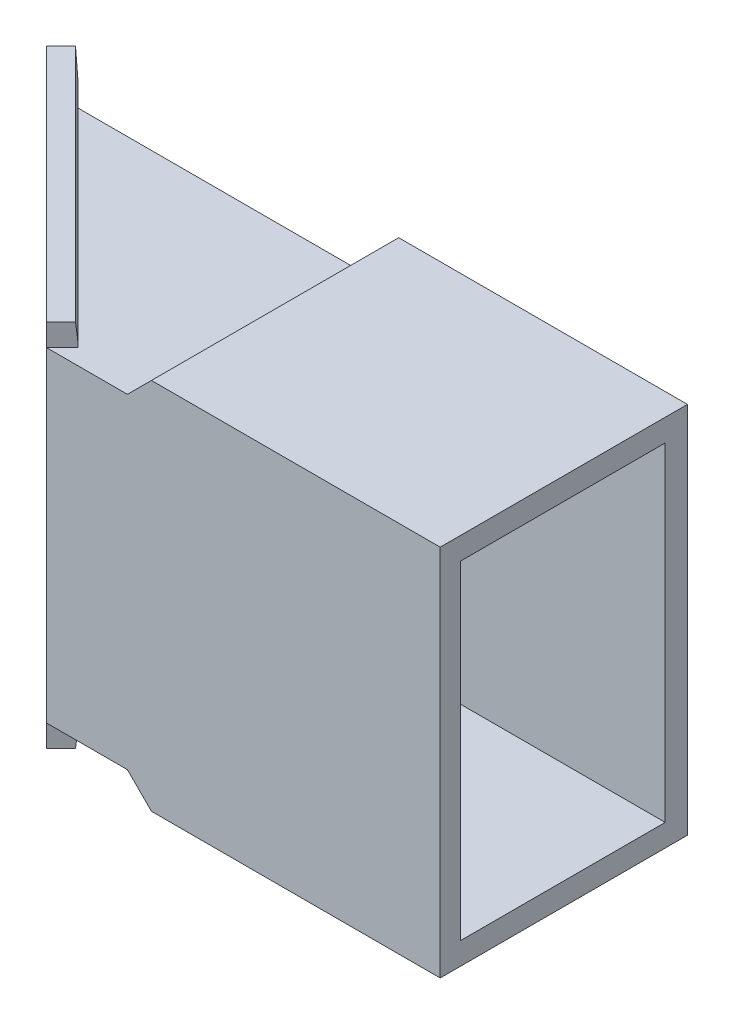
ISO-10303-21;
HEADER;
FILE_DESCRIPTION(('STEP AP214'),'2;1');
FILE_NAME('part.step','',(''),(''),'','','');
FILE_SCHEMA(('AUTOMOTIVE_DESIGN { 1 0 10303 214 1 1 1 1 }'));
ENDSEC;
DATA;
#1=APPLICATION_CONTEXT('core data for automotive mechanical design processes');
#2=APPLICATION_PROTOCOL_DEFINITION('international standard','automotive_design',2000,#1);
#3=PRODUCT_CONTEXT('',#1,'mechanical');
#4=PRODUCT('Part','Part','',(#3));
#5=PRODUCT_RELATED_PRODUCT_CATEGORY('part','',(#4));
#6=PRODUCT_DEFINITION_FORMATION('','',#4);
#7=PRODUCT_DEFINITION_CONTEXT('part definition',#1,'design');
#8=PRODUCT_DEFINITION('design','',#6,#7);
#9=PRODUCT_DEFINITION_SHAPE('','',#8);
#10=(LENGTH_UNIT() NAMED_UNIT(*) SI_UNIT(.MILLI.,.METRE.));
#11=(NAMED_UNIT(*) PLANE_ANGLE_UNIT() SI_UNIT($,.RADIAN.));
#12=(NAMED_UNIT(*) SI_UNIT($,.STERADIAN.) SOLID_ANGLE_UNIT());
#13=UNCERTAINTY_MEASURE_WITH_UNIT(LENGTH_MEASURE(1.E-05),#10,'distance_accuracy_value','');
#14=(GEOMETRIC_REPRESENTATION_CONTEXT(3) GLOBAL_UNCERTAINTY_ASSIGNED_CONTEXT((#13)) GLOBAL_UNIT_ASSIGNED_CONTEXT((#10,
#11,#12)) REPRESENTATION_CONTEXT('',''));
#15=CARTESIAN_POINT('',(0.,0.,0.));
#16=DIRECTION('',(0.,0.,1.));
#17=DIRECTION('',(1.,0.,0.));
#18=AXIS2_PLACEMENT_3D('',#15,#16,#17);
#19=CARTESIAN_POINT('',(-2.54,7.2644,15.9258));
#20=DIRECTION('',(0.,0.,-1.));
#21=DIRECTION('',(-1.,0.,0.));
#22=AXIS2_PLACEMENT_3D('',#19,#20,#21);
#23=PLANE('',#22);
#24=DIRECTION('',(-0.707106781186547,0.707106781186548,0.));
#25=VECTOR('',#24,1.);
#26=CARTESIAN_POINT('',(47.879,-26.6192,15.9258));
#27=LINE('',#26,#25);
#28=CARTESIAN_POINT('',(47.879,-26.6192,15.9258));
#29=VERTEX_POINT('',#28);
#30=CARTESIAN_POINT('',(44.45,-23.1902,15.9258));
#31=VERTEX_POINT('',#30);
#32=EDGE_CURVE('E281',#29,#31,#27,.T.);
#33=ORIENTED_EDGE('',*,*,#32,.F.);
#34=DIRECTION('',(-1.,0.,0.));
#35=VECTOR('',#34,1.);
#36=CARTESIAN_POINT('',(89.0778,-26.6192,15.9258));
#37=LINE('',#36,#35);
#38=CARTESIAN_POINT('',(89.0778,-26.6192,15.9258));
#39=VERTEX_POINT('',#38);
#40=EDGE_CURVE('E276',#39,#29,#37,.T.);
#41=ORIENTED_EDGE('',*,*,#40,.F.);
#42=DIRECTION('',(0.,-1.,0.));
#43=VECTOR('',#42,1.);
#44=CARTESIAN_POINT('',(89.0778,-26.6192,15.9258));
#45=LINE('',#44,#43);
#46=CARTESIAN_POINT('',(89.0778,26.6192,15.9258));
#47=VERTEX_POINT('',#46);
#48=EDGE_CURVE('E253',#47,#39,#45,.T.);
#49=ORIENTED_EDGE('',*,*,#48,.F.);
#50=DIRECTION('',(-1.,0.,0.));
#51=VECTOR('',#50,1.);
#52=CARTESIAN_POINT('',(89.0778,26.6192,15.9258));
#53=LINE('',#52,#51);
#54=CARTESIAN_POINT('',(47.879,26.6192,15.9258));
#55=VERTEX_POINT('',#54);
#56=EDGE_CURVE('E268',#47,#55,#53,.T.);
#57=ORIENTED_EDGE('',*,*,#56,.T.);
#58=DIRECTION('',(0.707106781186547,0.707106781186548,0.));
#59=VECTOR('',#58,1.);
#60=CARTESIAN_POINT('',(44.45,23.1902,15.9258));
#61=LINE('',#60,#59);
#62=CARTESIAN_POINT('',(44.45,23.1902,15.9258));
#63=VERTEX_POINT('',#62);
#64=EDGE_CURVE('E285',#63,#55,#61,.T.);
#65=ORIENTED_EDGE('',*,*,#64,.F.);
#66=DIRECTION('',(-1.,0.,0.));
#67=VECTOR('',#66,1.);
#68=CARTESIAN_POINT('',(-2.54,23.1902,15.9258));
#69=LINE('',#68,#67);
#70=CARTESIAN_POINT('',(32.9127280605346,23.1902,15.9258));
#71=VERTEX_POINT('',#70);
#72=EDGE_CURVE('E289',#71,#63,#69,.F.);
#73=ORIENTED_EDGE('',*,*,#72,.F.);
#74=DIRECTION('',(0.,1.,0.));
#75=VECTOR('',#74,1.);
#76=CARTESIAN_POINT('',(32.9127280605346,7.2644,15.9258));
#77=LINE('',#76,#75);
#78=CARTESIAN_POINT('',(32.9127280605346,-23.1902,15.9258));
#79=VERTEX_POINT('',#78);
#80=EDGE_CURVE('E11',#79,#71,#77,.T.);
#81=ORIENTED_EDGE('',*,*,#80,.F.);
#82=DIRECTION('',(-1.,0.,0.));
#83=VECTOR('',#82,1.);
#84=CARTESIAN_POINT('',(-2.54,-23.1902,15.9258));
#85=LINE('',#84,#83);
#86=EDGE_CURVE('E45',#31,#79,#85,.T.);
#87=ORIENTED_EDGE('',*,*,#86,.F.);
#88=EDGE_LOOP('',(#33,#41,#49,#57,#65,#73,#81,#87));
#89=FACE_BOUND('',#88,.T.);
#90=ADVANCED_FACE('F35',(#89),#23,.F.);
#91=CARTESIAN_POINT('',(18.1094600756682,23.8252,-3.36759604540094));
#92=DIRECTION('',(-0.703597544730292,-0.0995037190209983,0.703597544730292));
#93=DIRECTION('',(0.707106781186547,0.,0.707106781186547));
#94=AXIS2_PLACEMENT_3D('',#91,#92,#93);
#95=PLANE('',#94);
#96=DIRECTION('',(0.707106781186548,0.,0.707106781186548));
#97=VECTOR('',#96,1.);
#98=CARTESIAN_POINT('',(18.1094600756682,23.8252,-3.36759604540094));
#99=LINE('',#98,#97);
#100=CARTESIAN_POINT('',(35.1577920908019,23.8252,13.6807359697327));
#101=VERTEX_POINT('',#100);
#102=CARTESIAN_POINT('',(2.8571792847484,23.8252,-18.6198768363207));
#103=VERTEX_POINT('',#102);
#104=EDGE_CURVE('E409',#101,#103,#99,.F.);
#105=ORIENTED_EDGE('',*,*,#104,.T.);
#106=DIRECTION('',(-0.548630134859201,0.705345615858594,-0.448879201248438));
#107=VECTOR('',#106,1.);
#108=CARTESIAN_POINT('',(2.85717928474839,23.8252,-18.6198768363207));
#109=LINE('',#108,#107);
#110=CARTESIAN_POINT('',(0.881522938113187,26.3652,-20.2363229381132));
#111=VERTEX_POINT('',#110);
#112=EDGE_CURVE('E39',#103,#111,#109,.T.);
#113=ORIENTED_EDGE('',*,*,#112,.T.);
#114=DIRECTION('',(0.707106781186548,0.,0.707106781186547));
#115=VECTOR('',#114,1.);
#116=CARTESIAN_POINT('',(0.881522938113183,26.3652,-20.2363229381132));
#117=LINE('',#116,#115);
#118=CARTESIAN_POINT('',(34.9781869683805,26.3652,13.8603410921541));
#119=VERTEX_POINT('',#118);
#120=EDGE_CURVE('E375',#111,#119,#117,.T.);
#121=ORIENTED_EDGE('',*,*,#120,.T.);
#122=DIRECTION('',(0.0703597544730353,-0.995037190209988,-0.070359754473036));
#123=VECTOR('',#122,1.);
#124=CARTESIAN_POINT('',(34.9781869683805,26.3652,13.8603410921541));
#125=LINE('',#124,#123);
#126=EDGE_CURVE('E383',#119,#101,#125,.T.);
#127=ORIENTED_EDGE('',*,*,#126,.T.);
#128=EDGE_LOOP('',(#105,#113,#121,#127));
#129=FACE_BOUND('',#128,.T.);
#130=ADVANCED_FACE('F37',(#129),#95,.F.);
#131=CARTESIAN_POINT('',(2.8571792847484,7.2644,-18.6198768363207));
#132=DIRECTION('',(-0.633237790257263,0.,0.773957299203321));
#133=DIRECTION('',(0.773957299203321,0.,0.633237790257263));
#134=AXIS2_PLACEMENT_3D('',#131,#132,#133);
#135=PLANE('',#134);
#136=DIRECTION('',(-0.548630134859201,-0.705345615858593,-0.448879201248439));
#137=VECTOR('',#136,1.);
#138=CARTESIAN_POINT('',(2.85717928474838,-23.8252,-18.6198768363208));
#139=LINE('',#138,#137);
#140=CARTESIAN_POINT('',(2.85717928474837,-23.8252,-18.6198768363207));
#141=VERTEX_POINT('',#140);
#142=CARTESIAN_POINT('',(0.88152293811317,-26.3652,-20.2363229381132));
#143=VERTEX_POINT('',#142);
#144=EDGE_CURVE('E416',#141,#143,#139,.T.);
#145=ORIENTED_EDGE('',*,*,#144,.T.);
#146=DIRECTION('',(0.,1.,0.));
#147=VECTOR('',#146,1.);
#148=CARTESIAN_POINT('',(0.881522938113225,7.2644,-20.2363229381133));
#149=LINE('',#148,#147);
#150=EDGE_CURVE('E363',#143,#111,#149,.T.);
#151=ORIENTED_EDGE('',*,*,#150,.T.);
#152=ORIENTED_EDGE('',*,*,#112,.F.);
#153=DIRECTION('',(0.,1.,0.));
#154=VECTOR('',#153,1.);
#155=CARTESIAN_POINT('',(2.85717928474842,7.2644,-18.6198768363207));
#156=LINE('',#155,#154);
#157=EDGE_CURVE('E405',#103,#141,#156,.F.);
#158=ORIENTED_EDGE('',*,*,#157,.T.);
#159=EDGE_LOOP('',(#145,#151,#152,#158));
#160=FACE_BOUND('',#159,.T.);
#161=ADVANCED_FACE('F428',(#160),#135,.F.);
#162=CARTESIAN_POINT('',(18.1094600756682,-23.8252,-3.36759604540096));
#163=DIRECTION('',(-0.703597544730292,0.0995037190209977,0.703597544730292));
#164=DIRECTION('',(0.707106781186547,0.,0.707106781186547));
#165=AXIS2_PLACEMENT_3D('',#162,#163,#164);
#166=PLANE('',#165);
#167=DIRECTION('',(-0.707106781186547,0.,-0.707106781186548));
#168=VECTOR('',#167,1.);
#169=CARTESIAN_POINT('',(34.9781869683805,-26.3652,13.8603410921541));
#170=LINE('',#169,#168);
#171=CARTESIAN_POINT('',(34.9781869683805,-26.3652,13.8603410921541));
#172=VERTEX_POINT('',#171);
#173=EDGE_CURVE('E359',#172,#143,#170,.T.);
#174=ORIENTED_EDGE('',*,*,#173,.T.);
#175=ORIENTED_EDGE('',*,*,#144,.F.);
#176=DIRECTION('',(0.707106781186548,0.,0.707106781186548));
#177=VECTOR('',#176,1.);
#178=CARTESIAN_POINT('',(18.1094600756682,-23.8252,-3.36759604540094));
#179=LINE('',#178,#177);
#180=CARTESIAN_POINT('',(35.1577920908019,-23.8252,13.6807359697327));
#181=VERTEX_POINT('',#180);
#182=EDGE_CURVE('E401',#141,#181,#179,.T.);
#183=ORIENTED_EDGE('',*,*,#182,.T.);
#184=DIRECTION('',(-0.0703597544730353,-0.995037190209988,0.0703597544730353));
#185=VECTOR('',#184,1.);
#186=CARTESIAN_POINT('',(35.1577920908019,-23.8252,13.6807359697327));
#187=LINE('',#186,#185);
#188=EDGE_CURVE('E391',#181,#172,#187,.T.);
#189=ORIENTED_EDGE('',*,*,#188,.T.);
#190=EDGE_LOOP('',(#174,#175,#183,#189));
#191=FACE_BOUND('',#190,.T.);
#192=ADVANCED_FACE('F450',(#191),#166,.F.);
#193=CARTESIAN_POINT('',(47.879,7.2644,-19.3548));
#194=DIRECTION('',(-0.707106781186548,0.,-0.707106781186548));
#195=DIRECTION('',(-0.707106781186548,0.,0.707106781186548));
#196=AXIS2_PLACEMENT_3D('',#193,#194,#195);
#197=PLANE('',#196);
#198=DIRECTION('',(0.,1.,0.));
#199=VECTOR('',#198,1.);
#200=CARTESIAN_POINT('',(44.45,7.2644,-15.9258));
#201=LINE('',#200,#199);
#202=CARTESIAN_POINT('',(44.45,23.1902,-15.9258));
#203=VERTEX_POINT('',#202);
#204=CARTESIAN_POINT('',(44.45,-23.1902,-15.9258));
#205=VERTEX_POINT('',#204);
#206=EDGE_CURVE('E398',#203,#205,#201,.F.);
#207=ORIENTED_EDGE('',*,*,#206,.F.);
#208=DIRECTION('',(-0.577350269189626,-0.577350269189626,0.577350269189626));
#209=VECTOR('',#208,1.);
#210=CARTESIAN_POINT('',(47.879,26.6192,-19.3548));
#211=LINE('',#210,#209);
#212=CARTESIAN_POINT('',(47.879,26.6192,-19.3548));
#213=VERTEX_POINT('',#212);
#214=EDGE_CURVE('E337',#213,#203,#211,.T.);
#215=ORIENTED_EDGE('',*,*,#214,.F.);
#216=DIRECTION('',(0.,1.,0.));
#217=VECTOR('',#216,1.);
#218=CARTESIAN_POINT('',(47.879,7.2644,-19.3548));
#219=LINE('',#218,#217);
#220=CARTESIAN_POINT('',(47.879,-26.6192,-19.3548));
#221=VERTEX_POINT('',#220);
#222=EDGE_CURVE('E413',#213,#221,#219,.F.);
#223=ORIENTED_EDGE('',*,*,#222,.T.);
#224=DIRECTION('',(0.577350269189626,-0.577350269189625,-0.577350269189626));
#225=VECTOR('',#224,1.);
#226=CARTESIAN_POINT('',(44.45,-23.1902,-15.9258));
#227=LINE('',#226,#225);
#228=EDGE_CURVE('E327',#205,#221,#227,.T.);
#229=ORIENTED_EDGE('',*,*,#228,.F.);
#230=EDGE_LOOP('',(#207,#215,#223,#229));
#231=FACE_BOUND('',#230,.T.);
#232=ADVANCED_FACE('F495',(#231),#197,.T.);
#233=CARTESIAN_POINT('',(18.1094600756682,7.2644,-3.36759604540094));
#234=DIRECTION('',(-0.707106781186548,0.,0.707106781186548));
#235=DIRECTION('',(0.707106781186548,0.,0.707106781186548));
#236=AXIS2_PLACEMENT_3D('',#233,#234,#235);
#237=PLANE('',#236);
#238=DIRECTION('',(-0.707106781186548,0.,-0.707106781186547));
#239=VECTOR('',#238,1.);
#240=CARTESIAN_POINT('',(35.1577920908019,-23.1902,13.6807359697327));
#241=LINE('',#240,#239);
#242=CARTESIAN_POINT('',(35.1577920908019,-23.1902,13.6807359697327));
#243=VERTEX_POINT('',#242);
#244=CARTESIAN_POINT('',(5.55125612106915,-23.1902,-15.9258));
#245=VERTEX_POINT('',#244);
#246=EDGE_CURVE('E316',#243,#245,#241,.T.);
#247=ORIENTED_EDGE('',*,*,#246,.F.);
#248=DIRECTION('',(0.,1.,0.));
#249=VECTOR('',#248,1.);
#250=CARTESIAN_POINT('',(35.1577920908019,-24.7777,13.6807359697327));
#251=LINE('',#250,#249);
#252=EDGE_CURVE('E387',#243,#181,#251,.F.);
#253=ORIENTED_EDGE('',*,*,#252,.T.);
#254=ORIENTED_EDGE('',*,*,#182,.F.);
#255=ORIENTED_EDGE('',*,*,#157,.F.);
#256=ORIENTED_EDGE('',*,*,#104,.F.);
#257=DIRECTION('',(0.,1.,0.));
#258=VECTOR('',#257,1.);
#259=CARTESIAN_POINT('',(35.1577920908019,24.7777,13.6807359697327));
#260=LINE('',#259,#258);
#261=CARTESIAN_POINT('',(35.1577920908019,23.1902,13.6807359697327));
#262=VERTEX_POINT('',#261);
#263=EDGE_CURVE('E379',#101,#262,#260,.F.);
#264=ORIENTED_EDGE('',*,*,#263,.T.);
#265=DIRECTION('',(0.707106781186548,0.,0.707106781186547));
#266=VECTOR('',#265,1.);
#267=CARTESIAN_POINT('',(5.55125612106915,23.1902,-15.9258));
#268=LINE('',#267,#266);
#269=CARTESIAN_POINT('',(5.55125612106915,23.1902,-15.9258));
#270=VERTEX_POINT('',#269);
#271=EDGE_CURVE('E344',#270,#262,#268,.T.);
#272=ORIENTED_EDGE('',*,*,#271,.F.);
#273=DIRECTION('',(0.,1.,0.));
#274=VECTOR('',#273,1.);
#275=CARTESIAN_POINT('',(5.55125612106915,7.2644,-15.9258));
#276=LINE('',#275,#274);
#277=EDGE_CURVE('E395',#245,#270,#276,.T.);
#278=ORIENTED_EDGE('',*,*,#277,.F.);
#279=EDGE_LOOP('',(#247,#253,#254,#255,#256,#264,#272,#278));
#280=FACE_BOUND('',#279,.T.);
#281=ADVANCED_FACE('F446',(#280),#237,.F.);
#282=CARTESIAN_POINT('',(-2.54,7.2644,-15.9258));
#283=DIRECTION('',(0.,0.,-1.));
#284=DIRECTION('',(-1.,0.,0.));
#285=AXIS2_PLACEMENT_3D('',#282,#283,#284);
#286=PLANE('',#285);
#287=ORIENTED_EDGE('',*,*,#277,.T.);
#288=DIRECTION('',(1.,0.,0.));
#289=VECTOR('',#288,1.);
#290=CARTESIAN_POINT('',(-2.54,23.1902,-15.9258));
#291=LINE('',#290,#289);
#292=EDGE_CURVE('E347',#203,#270,#291,.F.);
#293=ORIENTED_EDGE('',*,*,#292,.F.);
#294=ORIENTED_EDGE('',*,*,#206,.T.);
#295=DIRECTION('',(1.,0.,0.));
#296=VECTOR('',#295,1.);
#297=CARTESIAN_POINT('',(-2.54,-23.1902,-15.9258));
#298=LINE('',#297,#296);
#299=EDGE_CURVE('E312',#245,#205,#298,.T.);
#300=ORIENTED_EDGE('',*,*,#299,.F.);
#301=EDGE_LOOP('',(#287,#293,#294,#300));
#302=FACE_BOUND('',#301,.T.);
#303=ADVANCED_FACE('F493',(#302),#286,.T.);
#304=CARTESIAN_POINT('',(35.1577920908019,-24.7777,13.6807359697327));
#305=DIRECTION('',(-0.707106781186548,0.,-0.707106781186548));
#306=DIRECTION('',(-0.707106781186548,0.,0.707106781186548));
#307=AXIS2_PLACEMENT_3D('',#304,#305,#306);
#308=PLANE('',#307);
#309=DIRECTION('',(0.707106781186548,0.,-0.707106781186548));
#310=VECTOR('',#309,1.);
#311=CARTESIAN_POINT('',(32.9127280605346,-23.1902,15.9258));
#312=LINE('',#311,#310);
#313=EDGE_CURVE('E319',#79,#243,#312,.T.);
#314=ORIENTED_EDGE('',*,*,#313,.F.);
#315=DIRECTION('',(0.,1.,0.));
#316=VECTOR('',#315,1.);
#317=CARTESIAN_POINT('',(32.9127280605346,7.2644,15.9258));
#318=LINE('',#317,#316);
#319=CARTESIAN_POINT('',(32.9127280605346,-26.3652,15.9258));
#320=VERTEX_POINT('',#319);
#321=EDGE_CURVE('E306',#320,#79,#318,.T.);
#322=ORIENTED_EDGE('',*,*,#321,.F.);
#323=DIRECTION('',(0.707106781186548,0.,-0.707106781186547));
#324=VECTOR('',#323,1.);
#325=CARTESIAN_POINT('',(32.9127280605346,-26.3652,15.9258));
#326=LINE('',#325,#324);
#327=EDGE_CURVE('E351',#320,#172,#326,.T.);
#328=ORIENTED_EDGE('',*,*,#327,.T.);
#329=ORIENTED_EDGE('',*,*,#188,.F.);
#330=ORIENTED_EDGE('',*,*,#252,.F.);
#331=EDGE_LOOP('',(#314,#322,#328,#329,#330));
#332=FACE_BOUND('',#331,.T.);
#333=ADVANCED_FACE('F456',(#332),#308,.F.);
#334=CARTESIAN_POINT('',(35.1577920908019,24.7777,13.6807359697327));
#335=DIRECTION('',(-0.707106781186548,0.,-0.707106781186548));
#336=DIRECTION('',(-0.707106781186548,0.,0.707106781186548));
#337=AXIS2_PLACEMENT_3D('',#334,#335,#336);
#338=PLANE('',#337);
#339=ORIENTED_EDGE('',*,*,#126,.F.);
#340=DIRECTION('',(-0.707106781186547,0.,0.707106781186547));
#341=VECTOR('',#340,1.);
#342=CARTESIAN_POINT('',(34.9781869683805,26.3652,13.8603410921541));
#343=LINE('',#342,#341);
#344=CARTESIAN_POINT('',(32.9127280605346,26.3652,15.9258));
#345=VERTEX_POINT('',#344);
#346=EDGE_CURVE('E371',#119,#345,#343,.T.);
#347=ORIENTED_EDGE('',*,*,#346,.T.);
#348=DIRECTION('',(0.,1.,0.));
#349=VECTOR('',#348,1.);
#350=CARTESIAN_POINT('',(32.9127280605346,7.2644,15.9258));
#351=LINE('',#350,#349);
#352=EDGE_CURVE('E303',#71,#345,#351,.T.);
#353=ORIENTED_EDGE('',*,*,#352,.F.);
#354=DIRECTION('',(-0.707106781186548,0.,0.707106781186548));
#355=VECTOR('',#354,1.);
#356=CARTESIAN_POINT('',(35.1577920908019,23.1902,13.6807359697327));
#357=LINE('',#356,#355);
#358=EDGE_CURVE('E341',#262,#71,#357,.T.);
#359=ORIENTED_EDGE('',*,*,#358,.F.);
#360=ORIENTED_EDGE('',*,*,#263,.F.);
#361=EDGE_LOOP('',(#339,#347,#353,#359,#360));
#362=FACE_BOUND('',#361,.T.);
#363=ADVANCED_FACE('F440',(#362),#338,.F.);
#364=CARTESIAN_POINT('',(18.1094600756682,26.3652,-3.36759604540094));
#365=DIRECTION('',(0.,-1.,0.));
#366=DIRECTION('',(0.,0.,-1.));
#367=AXIS2_PLACEMENT_3D('',#364,#365,#366);
#368=PLANE('',#367);
#369=ORIENTED_EDGE('',*,*,#120,.F.);
#370=DIRECTION('',(0.707106781186548,0.,-0.707106781186548));
#371=VECTOR('',#370,1.);
#372=CARTESIAN_POINT('',(1.06112806053457,26.3652,-20.4159280605346));
#373=LINE('',#372,#371);
#374=CARTESIAN_POINT('',(-1.18393596973272,26.3652,-18.1708640302673));
#375=VERTEX_POINT('',#374);
#376=EDGE_CURVE('E367',#111,#375,#373,.F.);
#377=ORIENTED_EDGE('',*,*,#376,.T.);
#378=DIRECTION('',(0.707106781186548,0.,0.707106781186548));
#379=VECTOR('',#378,1.);
#380=CARTESIAN_POINT('',(14.7418640302673,26.3652,-2.24506403026728));
#381=LINE('',#380,#379);
#382=EDGE_CURVE('E300',#345,#375,#381,.F.);
#383=ORIENTED_EDGE('',*,*,#382,.F.);
#384=ORIENTED_EDGE('',*,*,#346,.F.);
#385=EDGE_LOOP('',(#369,#377,#383,#384));
#386=FACE_BOUND('',#385,.T.);
#387=ADVANCED_FACE('F436',(#386),#368,.F.);
#388=CARTESIAN_POINT('',(1.06112806053457,7.2644,-20.4159280605346));
#389=DIRECTION('',(0.707106781186548,0.,0.707106781186548));
#390=DIRECTION('',(0.707106781186548,0.,-0.707106781186548));
#391=AXIS2_PLACEMENT_3D('',#388,#389,#390);
#392=PLANE('',#391);
#393=DIRECTION('',(-0.707106781186531,0.,0.707106781186564));
#394=VECTOR('',#393,1.);
#395=CARTESIAN_POINT('',(0.881522938113183,-26.3652,-20.2363229381133));
#396=LINE('',#395,#394);
#397=CARTESIAN_POINT('',(-1.18393596973272,-26.3652,-18.1708640302673));
#398=VERTEX_POINT('',#397);
#399=EDGE_CURVE('E355',#143,#398,#396,.T.);
#400=ORIENTED_EDGE('',*,*,#399,.T.);
#401=DIRECTION('',(0.,1.,0.));
#402=VECTOR('',#401,1.);
#403=CARTESIAN_POINT('',(-1.18393596973272,7.2644,-18.1708640302673));
#404=LINE('',#403,#402);
#405=EDGE_CURVE('E297',#375,#398,#404,.F.);
#406=ORIENTED_EDGE('',*,*,#405,.F.);
#407=ORIENTED_EDGE('',*,*,#376,.F.);
#408=ORIENTED_EDGE('',*,*,#150,.F.);
#409=EDGE_LOOP('',(#400,#406,#407,#408));
#410=FACE_BOUND('',#409,.T.);
#411=ADVANCED_FACE('F431',(#410),#392,.F.);
#412=CARTESIAN_POINT('',(18.1094600756682,-26.3652,-3.36759604540096));
#413=DIRECTION('',(0.,1.,0.));
#414=DIRECTION('',(0.,0.,1.));
#415=AXIS2_PLACEMENT_3D('',#412,#413,#414);
#416=PLANE('',#415);
#417=DIRECTION('',(0.707106781186548,0.,0.707106781186548));
#418=VECTOR('',#417,1.);
#419=CARTESIAN_POINT('',(14.7418640302673,-26.3652,-2.24506403026728));
#420=LINE('',#419,#418);
#421=EDGE_CURVE('E293',#398,#320,#420,.T.);
#422=ORIENTED_EDGE('',*,*,#421,.F.);
#423=ORIENTED_EDGE('',*,*,#399,.F.);
#424=ORIENTED_EDGE('',*,*,#173,.F.);
#425=ORIENTED_EDGE('',*,*,#327,.F.);
#426=EDGE_LOOP('',(#422,#423,#424,#425));
#427=FACE_BOUND('',#426,.T.);
#428=ADVANCED_FACE('F452',(#427),#416,.F.);
#429=CARTESIAN_POINT('',(-2.54,23.1902,0.));
#430=DIRECTION('',(0.,1.,0.));
#431=DIRECTION('',(0.,0.,1.));
#432=AXIS2_PLACEMENT_3D('',#429,#430,#431);
#433=PLANE('',#432);
#434=ORIENTED_EDGE('',*,*,#271,.T.);
#435=ORIENTED_EDGE('',*,*,#358,.T.);
#436=ORIENTED_EDGE('',*,*,#72,.T.);
#437=DIRECTION('',(0.,0.,1.));
#438=VECTOR('',#437,1.);
#439=CARTESIAN_POINT('',(44.45,23.1902,-1.7145));
#440=LINE('',#439,#438);
#441=EDGE_CURVE('E334',#203,#63,#440,.T.);
#442=ORIENTED_EDGE('',*,*,#441,.F.);
#443=ORIENTED_EDGE('',*,*,#292,.T.);
#444=EDGE_LOOP('',(#434,#435,#436,#442,#443));
#445=FACE_BOUND('',#444,.T.);
#446=ADVANCED_FACE('F491',(#445),#433,.T.);
#447=CARTESIAN_POINT('',(47.879,26.6192,-1.7145));
#448=DIRECTION('',(-0.707106781186548,0.707106781186548,0.));
#449=DIRECTION('',(-0.707106781186548,-0.707106781186548,0.));
#450=AXIS2_PLACEMENT_3D('',#447,#448,#449);
#451=PLANE('',#450);
#452=ORIENTED_EDGE('',*,*,#214,.T.);
#453=ORIENTED_EDGE('',*,*,#441,.T.);
#454=ORIENTED_EDGE('',*,*,#64,.T.);
#455=DIRECTION('',(0.,0.,1.));
#456=VECTOR('',#455,1.);
#457=CARTESIAN_POINT('',(47.879,26.6192,-1.7145));
#458=LINE('',#457,#456);
#459=EDGE_CURVE('E331',#213,#55,#458,.T.);
#460=ORIENTED_EDGE('',*,*,#459,.F.);
#461=EDGE_LOOP('',(#452,#453,#454,#460));
#462=FACE_BOUND('',#461,.T.);
#463=ADVANCED_FACE('F486',(#462),#451,.T.);
#464=CARTESIAN_POINT('',(47.879,-26.6192,-1.71450000000003));
#465=DIRECTION('',(-0.707106781186548,-0.707106781186548,0.));
#466=DIRECTION('',(0.707106781186548,-0.707106781186548,0.));
#467=AXIS2_PLACEMENT_3D('',#464,#465,#466);
#468=PLANE('',#467);
#469=ORIENTED_EDGE('',*,*,#228,.T.);
#470=DIRECTION('',(0.,0.,1.));
#471=VECTOR('',#470,1.);
#472=CARTESIAN_POINT('',(47.879,-26.6192,-1.71450000000003));
#473=LINE('',#472,#471);
#474=EDGE_CURVE('E323',#221,#29,#473,.T.);
#475=ORIENTED_EDGE('',*,*,#474,.T.);
#476=ORIENTED_EDGE('',*,*,#32,.T.);
#477=DIRECTION('',(0.,0.,-1.));
#478=VECTOR('',#477,1.);
#479=CARTESIAN_POINT('',(44.45,-23.1902,0.));
#480=LINE('',#479,#478);
#481=EDGE_CURVE('E309',#205,#31,#480,.F.);
#482=ORIENTED_EDGE('',*,*,#481,.F.);
#483=EDGE_LOOP('',(#469,#475,#476,#482));
#484=FACE_BOUND('',#483,.T.);
#485=ADVANCED_FACE('F469',(#484),#468,.T.);
#486=CARTESIAN_POINT('',(-2.54,-23.1902,0.));
#487=DIRECTION('',(0.,-1.,0.));
#488=DIRECTION('',(0.,0.,-1.));
#489=AXIS2_PLACEMENT_3D('',#486,#487,#488);
#490=PLANE('',#489);
#491=ORIENTED_EDGE('',*,*,#299,.T.);
#492=ORIENTED_EDGE('',*,*,#481,.T.);
#493=ORIENTED_EDGE('',*,*,#86,.T.);
#494=ORIENTED_EDGE('',*,*,#313,.T.);
#495=ORIENTED_EDGE('',*,*,#246,.T.);
#496=EDGE_LOOP('',(#491,#492,#493,#494,#495));
#497=FACE_BOUND('',#496,.T.);
#498=ADVANCED_FACE('F464',(#497),#490,.T.);
#499=CARTESIAN_POINT('',(14.7418640302673,7.2644,-2.24506403026728));
#500=DIRECTION('',(-0.707106781186548,0.,0.707106781186548));
#501=DIRECTION('',(0.707106781186548,0.,0.707106781186548));
#502=AXIS2_PLACEMENT_3D('',#499,#500,#501);
#503=PLANE('',#502);
#504=DIRECTION('',(0.,-1.,0.));
#505=VECTOR('',#504,1.);
#506=CARTESIAN_POINT('',(29.7377280605346,20.0152,12.7508));
#507=LINE('',#506,#505);
#508=CARTESIAN_POINT('',(29.7377280605346,20.0152,12.7508));
#509=VERTEX_POINT('',#508);
#510=CARTESIAN_POINT('',(29.7377280605346,-20.0152,12.7508));
#511=VERTEX_POINT('',#510);
#512=EDGE_CURVE('E203',#509,#511,#507,.T.);
#513=ORIENTED_EDGE('',*,*,#512,.T.);
#514=DIRECTION('',(-0.707106781186548,0.,-0.707106781186548));
#515=VECTOR('',#514,1.);
#516=CARTESIAN_POINT('',(14.2763960454009,-20.0152,-2.71053201513365));
#517=LINE('',#516,#515);
#518=CARTESIAN_POINT('',(4.23612806053458,-20.0152,-12.7508));
#519=VERTEX_POINT('',#518);
#520=EDGE_CURVE('E192',#511,#519,#517,.T.);
#521=ORIENTED_EDGE('',*,*,#520,.T.);
#522=DIRECTION('',(0.,1.,0.));
#523=VECTOR('',#522,1.);
#524=CARTESIAN_POINT('',(4.23612806053458,-20.0152,-12.7508));
#525=LINE('',#524,#523);
#526=CARTESIAN_POINT('',(4.23612806053458,20.0152,-12.7508));
#527=VERTEX_POINT('',#526);
#528=EDGE_CURVE('E214',#519,#527,#525,.T.);
#529=ORIENTED_EDGE('',*,*,#528,.T.);
#530=DIRECTION('',(0.707106781186548,0.,0.707106781186548));
#531=VECTOR('',#530,1.);
#532=CARTESIAN_POINT('',(1.52559604540093,20.0152,-15.4613320151337));
#533=LINE('',#532,#531);
#534=EDGE_CURVE('E210',#527,#509,#533,.T.);
#535=ORIENTED_EDGE('',*,*,#534,.T.);
#536=EDGE_LOOP('',(#513,#521,#529,#535));
#537=FACE_BOUND('',#536,.T.);
#538=ORIENTED_EDGE('',*,*,#405,.T.);
#539=ORIENTED_EDGE('',*,*,#421,.T.);
#540=ORIENTED_EDGE('',*,*,#321,.T.);
#541=ORIENTED_EDGE('',*,*,#80,.T.);
#542=ORIENTED_EDGE('',*,*,#352,.T.);
#543=ORIENTED_EDGE('',*,*,#382,.T.);
#544=EDGE_LOOP('',(#538,#539,#540,#541,#542,#543));
#545=FACE_BOUND('',#544,.T.);
#546=ADVANCED_FACE('F208',(#537,#545),#503,.T.);
#547=CARTESIAN_POINT('',(89.0778,-26.6192,-19.3548));
#548=DIRECTION('',(0.,1.,0.));
#549=DIRECTION('',(0.,0.,1.));
#550=AXIS2_PLACEMENT_3D('',#547,#548,#549);
#551=PLANE('',#550);
#552=ORIENTED_EDGE('',*,*,#474,.F.);
#553=DIRECTION('',(-1.,0.,0.));
#554=VECTOR('',#553,1.);
#555=CARTESIAN_POINT('',(89.0778,-26.6192,-19.3548));
#556=LINE('',#555,#554);
#557=CARTESIAN_POINT('',(89.0778,-26.6192,-19.3548));
#558=VERTEX_POINT('',#557);
#559=EDGE_CURVE('E274',#558,#221,#556,.T.);
#560=ORIENTED_EDGE('',*,*,#559,.F.);
#561=DIRECTION('',(0.,0.,-1.));
#562=VECTOR('',#561,1.);
#563=CARTESIAN_POINT('',(89.0778,-26.6192,-19.3548));
#564=LINE('',#563,#562);
#565=EDGE_CURVE('E262',#39,#558,#564,.T.);
#566=ORIENTED_EDGE('',*,*,#565,.F.);
#567=ORIENTED_EDGE('',*,*,#40,.T.);
#568=EDGE_LOOP('',(#552,#560,#566,#567));
#569=FACE_BOUND('',#568,.T.);
#570=ADVANCED_FACE('F474',(#569),#551,.F.);
#571=CARTESIAN_POINT('',(89.0778,26.6192,-19.3548));
#572=DIRECTION('',(0.,0.,1.));
#573=DIRECTION('',(1.,0.,0.));
#574=AXIS2_PLACEMENT_3D('',#571,#572,#573);
#575=PLANE('',#574);
#576=ORIENTED_EDGE('',*,*,#222,.F.);
#577=DIRECTION('',(-1.,0.,0.));
#578=VECTOR('',#577,1.);
#579=CARTESIAN_POINT('',(89.0778,26.6192,-19.3548));
#580=LINE('',#579,#578);
#581=CARTESIAN_POINT('',(89.0778,26.6192,-19.3548));
#582=VERTEX_POINT('',#581);
#583=EDGE_CURVE('E271',#582,#213,#580,.T.);
#584=ORIENTED_EDGE('',*,*,#583,.F.);
#585=DIRECTION('',(0.,1.,0.));
#586=VECTOR('',#585,1.);
#587=CARTESIAN_POINT('',(89.0778,26.6192,-19.3548));
#588=LINE('',#587,#586);
#589=EDGE_CURVE('E264',#558,#582,#588,.T.);
#590=ORIENTED_EDGE('',*,*,#589,.F.);
#591=ORIENTED_EDGE('',*,*,#559,.T.);
#592=EDGE_LOOP('',(#576,#584,#590,#591));
#593=FACE_BOUND('',#592,.T.);
#594=ADVANCED_FACE('F497',(#593),#575,.F.);
#595=CARTESIAN_POINT('',(89.0778,26.6192,15.9258));
#596=DIRECTION('',(0.,-1.,0.));
#597=DIRECTION('',(0.,0.,-1.));
#598=AXIS2_PLACEMENT_3D('',#595,#596,#597);
#599=PLANE('',#598);
#600=ORIENTED_EDGE('',*,*,#459,.T.);
#601=ORIENTED_EDGE('',*,*,#56,.F.);
#602=DIRECTION('',(0.,0.,1.));
#603=VECTOR('',#602,1.);
#604=CARTESIAN_POINT('',(89.0778,26.6192,15.9258));
#605=LINE('',#604,#603);
#606=EDGE_CURVE('E266',#582,#47,#605,.T.);
#607=ORIENTED_EDGE('',*,*,#606,.F.);
#608=ORIENTED_EDGE('',*,*,#583,.T.);
#609=EDGE_LOOP('',(#600,#601,#607,#608));
#610=FACE_BOUND('',#609,.T.);
#611=ADVANCED_FACE('F483',(#610),#599,.F.);
#612=CARTESIAN_POINT('',(89.0778,0.,0.));
#613=DIRECTION('',(-1.,0.,0.));
#614=DIRECTION('',(0.,0.,1.));
#615=AXIS2_PLACEMENT_3D('',#612,#613,#614);
#616=PLANE('',#615);
#617=DIRECTION('',(0.,1.,0.));
#618=VECTOR('',#617,1.);
#619=CARTESIAN_POINT('',(89.0778,-23.4442,-16.1798));
#620=LINE('',#619,#618);
#621=CARTESIAN_POINT('',(89.0778,-23.4442,-16.1798));
#622=VERTEX_POINT('',#621);
#623=CARTESIAN_POINT('',(89.0778,23.4442,-16.1798));
#624=VERTEX_POINT('',#623);
#625=EDGE_CURVE('E243',#622,#624,#620,.T.);
#626=ORIENTED_EDGE('',*,*,#625,.F.);
#627=DIRECTION('',(0.,0.,-1.));
#628=VECTOR('',#627,1.);
#629=CARTESIAN_POINT('',(89.0778,-23.4442,13.0048));
#630=LINE('',#629,#628);
#631=CARTESIAN_POINT('',(89.0778,-23.4442,13.0048));
#632=VERTEX_POINT('',#631);
#633=EDGE_CURVE('E199',#632,#622,#630,.T.);
#634=ORIENTED_EDGE('',*,*,#633,.F.);
#635=DIRECTION('',(0.,-1.,0.));
#636=VECTOR('',#635,1.);
#637=CARTESIAN_POINT('',(89.0778,23.4442,13.0048));
#638=LINE('',#637,#636);
#639=CARTESIAN_POINT('',(89.0778,23.4442,13.0048));
#640=VERTEX_POINT('',#639);
#641=EDGE_CURVE('E232',#640,#632,#638,.T.);
#642=ORIENTED_EDGE('',*,*,#641,.F.);
#643=DIRECTION('',(0.,0.,1.));
#644=VECTOR('',#643,1.);
#645=CARTESIAN_POINT('',(89.0778,23.4442,-16.1798));
#646=LINE('',#645,#644);
#647=EDGE_CURVE('E246',#624,#640,#646,.T.);
#648=ORIENTED_EDGE('',*,*,#647,.F.);
#649=EDGE_LOOP('',(#626,#634,#642,#648));
#650=FACE_BOUND('',#649,.T.);
#651=ORIENTED_EDGE('',*,*,#48,.T.);
#652=ORIENTED_EDGE('',*,*,#565,.T.);
#653=ORIENTED_EDGE('',*,*,#589,.T.);
#654=ORIENTED_EDGE('',*,*,#606,.T.);
#655=EDGE_LOOP('',(#651,#652,#653,#654));
#656=FACE_BOUND('',#655,.T.);
#657=ADVANCED_FACE('F478',(#650,#656),#616,.F.);
#658=CARTESIAN_POINT('',(50.8,-23.4442,13.0048));
#659=DIRECTION('',(0.,-1.,0.));
#660=DIRECTION('',(0.,0.,-1.));
#661=AXIS2_PLACEMENT_3D('',#658,#659,#660);
#662=PLANE('',#661);
#663=ORIENTED_EDGE('',*,*,#633,.T.);
#664=DIRECTION('',(1.,0.,0.));
#665=VECTOR('',#664,1.);
#666=CARTESIAN_POINT('',(50.8,-23.4442,-16.1798));
#667=LINE('',#666,#665);
#668=CARTESIAN_POINT('',(50.8,-23.4442,-16.1798));
#669=VERTEX_POINT('',#668);
#670=EDGE_CURVE('E241',#669,#622,#667,.T.);
#671=ORIENTED_EDGE('',*,*,#670,.F.);
#672=DIRECTION('',(0.,0.,-1.));
#673=VECTOR('',#672,1.);
#674=CARTESIAN_POINT('',(50.8,-23.4442,13.0048));
#675=LINE('',#674,#673);
#676=CARTESIAN_POINT('',(50.8,-23.4442,13.0048));
#677=VERTEX_POINT('',#676);
#678=EDGE_CURVE('E228',#677,#669,#675,.T.);
#679=ORIENTED_EDGE('',*,*,#678,.F.);
#680=DIRECTION('',(1.,0.,0.));
#681=VECTOR('',#680,1.);
#682=CARTESIAN_POINT('',(50.8,-23.4442,13.0048));
#683=LINE('',#682,#681);
#684=EDGE_CURVE('E251',#677,#632,#683,.T.);
#685=ORIENTED_EDGE('',*,*,#684,.T.);
#686=EDGE_LOOP('',(#663,#671,#679,#685));
#687=FACE_BOUND('',#686,.T.);
#688=ADVANCED_FACE('F678',(#687),#662,.F.);
#689=CARTESIAN_POINT('',(50.8,23.4442,13.0048));
#690=DIRECTION('',(0.,0.,1.));
#691=DIRECTION('',(0.,-1.,0.));
#692=AXIS2_PLACEMENT_3D('',#689,#690,#691);
#693=PLANE('',#692);
#694=ORIENTED_EDGE('',*,*,#641,.T.);
#695=ORIENTED_EDGE('',*,*,#684,.F.);
#696=DIRECTION('',(0.,-1.,0.));
#697=VECTOR('',#696,1.);
#698=CARTESIAN_POINT('',(50.8,23.4442,13.0048));
#699=LINE('',#698,#697);
#700=CARTESIAN_POINT('',(50.8,23.4442,13.0048));
#701=VERTEX_POINT('',#700);
#702=EDGE_CURVE('E238',#701,#677,#699,.T.);
#703=ORIENTED_EDGE('',*,*,#702,.F.);
#704=DIRECTION('',(1.,0.,0.));
#705=VECTOR('',#704,1.);
#706=CARTESIAN_POINT('',(50.8,23.4442,13.0048));
#707=LINE('',#706,#705);
#708=EDGE_CURVE('E254',#701,#640,#707,.T.);
#709=ORIENTED_EDGE('',*,*,#708,.T.);
#710=EDGE_LOOP('',(#694,#695,#703,#709));
#711=FACE_BOUND('',#710,.T.);
#712=ADVANCED_FACE('F674',(#711),#693,.F.);
#713=CARTESIAN_POINT('',(50.8,23.4442,-16.1798));
#714=DIRECTION('',(0.,1.,0.));
#715=DIRECTION('',(0.,0.,1.));
#716=AXIS2_PLACEMENT_3D('',#713,#714,#715);
#717=PLANE('',#716);
#718=ORIENTED_EDGE('',*,*,#647,.T.);
#719=ORIENTED_EDGE('',*,*,#708,.F.);
#720=DIRECTION('',(0.,0.,1.));
#721=VECTOR('',#720,1.);
#722=CARTESIAN_POINT('',(50.8,23.4442,-16.1798));
#723=LINE('',#722,#721);
#724=CARTESIAN_POINT('',(50.8,23.4442,-16.1798));
#725=VERTEX_POINT('',#724);
#726=EDGE_CURVE('E235',#725,#701,#723,.T.);
#727=ORIENTED_EDGE('',*,*,#726,.F.);
#728=DIRECTION('',(1.,0.,0.));
#729=VECTOR('',#728,1.);
#730=CARTESIAN_POINT('',(50.8,23.4442,-16.1798));
#731=LINE('',#730,#729);
#732=EDGE_CURVE('E256',#725,#624,#731,.T.);
#733=ORIENTED_EDGE('',*,*,#732,.T.);
#734=EDGE_LOOP('',(#718,#719,#727,#733));
#735=FACE_BOUND('',#734,.T.);
#736=ADVANCED_FACE('F677',(#735),#717,.F.);
#737=CARTESIAN_POINT('',(50.8,-23.4442,-16.1798));
#738=DIRECTION('',(0.,0.,-1.));
#739=DIRECTION('',(-1.,0.,0.));
#740=AXIS2_PLACEMENT_3D('',#737,#738,#739);
#741=PLANE('',#740);
#742=ORIENTED_EDGE('',*,*,#625,.T.);
#743=ORIENTED_EDGE('',*,*,#732,.F.);
#744=DIRECTION('',(0.,1.,0.));
#745=VECTOR('',#744,1.);
#746=CARTESIAN_POINT('',(50.8,-23.4442,-16.1798));
#747=LINE('',#746,#745);
#748=EDGE_CURVE('E231',#669,#725,#747,.T.);
#749=ORIENTED_EDGE('',*,*,#748,.F.);
#750=ORIENTED_EDGE('',*,*,#670,.T.);
#751=EDGE_LOOP('',(#742,#743,#749,#750));
#752=FACE_BOUND('',#751,.T.);
#753=ADVANCED_FACE('F623',(#752),#741,.F.);
#754=CARTESIAN_POINT('',(50.8,0.,0.));
#755=DIRECTION('',(1.,0.,0.));
#756=DIRECTION('',(0.,0.,-1.));
#757=AXIS2_PLACEMENT_3D('',#754,#755,#756);
#758=PLANE('',#757);
#759=DIRECTION('',(0.,-1.,0.));
#760=VECTOR('',#759,1.);
#761=CARTESIAN_POINT('',(50.8,20.0152,12.7508));
#762=LINE('',#761,#760);
#763=CARTESIAN_POINT('',(50.8,20.0152,12.7508));
#764=VERTEX_POINT('',#763);
#765=CARTESIAN_POINT('',(50.8,-20.0152,12.7508));
#766=VERTEX_POINT('',#765);
#767=EDGE_CURVE('E61',#764,#766,#762,.T.);
#768=ORIENTED_EDGE('',*,*,#767,.F.);
#769=DIRECTION('',(0.,0.,1.));
#770=VECTOR('',#769,1.);
#771=CARTESIAN_POINT('',(50.8,20.0152,-12.7508));
#772=LINE('',#771,#770);
#773=CARTESIAN_POINT('',(50.8,20.0152,-12.7508));
#774=VERTEX_POINT('',#773);
#775=EDGE_CURVE('E205',#774,#764,#772,.T.);
#776=ORIENTED_EDGE('',*,*,#775,.F.);
#777=DIRECTION('',(0.,1.,0.));
#778=VECTOR('',#777,1.);
#779=CARTESIAN_POINT('',(50.8,-20.0152,-12.7508));
#780=LINE('',#779,#778);
#781=CARTESIAN_POINT('',(50.8,-20.0152,-12.7508));
#782=VERTEX_POINT('',#781);
#783=EDGE_CURVE('E219',#782,#774,#780,.T.);
#784=ORIENTED_EDGE('',*,*,#783,.F.);
#785=DIRECTION('',(0.,0.,-1.));
#786=VECTOR('',#785,1.);
#787=CARTESIAN_POINT('',(50.8,-20.0152,12.7508));
#788=LINE('',#787,#786);
#789=EDGE_CURVE('E212',#766,#782,#788,.T.);
#790=ORIENTED_EDGE('',*,*,#789,.F.);
#791=EDGE_LOOP('',(#768,#776,#784,#790));
#792=FACE_BOUND('',#791,.T.);
#793=ORIENTED_EDGE('',*,*,#678,.T.);
#794=ORIENTED_EDGE('',*,*,#748,.T.);
#795=ORIENTED_EDGE('',*,*,#726,.T.);
#796=ORIENTED_EDGE('',*,*,#702,.T.);
#797=EDGE_LOOP('',(#793,#794,#795,#796));
#798=FACE_BOUND('',#797,.T.);
#799=ADVANCED_FACE('F628',(#792,#798),#758,.T.);
#800=CARTESIAN_POINT('',(-1.18493596973272,20.0152,12.7508));
#801=DIRECTION('',(0.,0.,1.));
#802=DIRECTION('',(1.,0.,0.));
#803=AXIS2_PLACEMENT_3D('',#800,#801,#802);
#804=PLANE('',#803);
#805=DIRECTION('',(1.,0.,0.));
#806=VECTOR('',#805,1.);
#807=CARTESIAN_POINT('',(-1.18493596973272,20.0152,12.7508));
#808=LINE('',#807,#806);
#809=EDGE_CURVE('E200',#509,#764,#808,.T.);
#810=ORIENTED_EDGE('',*,*,#809,.T.);
#811=ORIENTED_EDGE('',*,*,#767,.T.);
#812=DIRECTION('',(1.,0.,0.));
#813=VECTOR('',#812,1.);
#814=CARTESIAN_POINT('',(-1.18493596973272,-20.0152,12.7508));
#815=LINE('',#814,#813);
#816=EDGE_CURVE('E194',#511,#766,#815,.T.);
#817=ORIENTED_EDGE('',*,*,#816,.F.);
#818=ORIENTED_EDGE('',*,*,#512,.F.);
#819=EDGE_LOOP('',(#810,#811,#817,#818));
#820=FACE_BOUND('',#819,.T.);
#821=ADVANCED_FACE('F202',(#820),#804,.F.);
#822=CARTESIAN_POINT('',(-1.18493596973272,20.0152,-12.7508));
#823=DIRECTION('',(0.,1.,0.));
#824=DIRECTION('',(0.,0.,1.));
#825=AXIS2_PLACEMENT_3D('',#822,#823,#824);
#826=PLANE('',#825);
#827=DIRECTION('',(1.,0.,0.));
#828=VECTOR('',#827,1.);
#829=CARTESIAN_POINT('',(-1.18493596973272,20.0152,-12.7508));
#830=LINE('',#829,#828);
#831=EDGE_CURVE('E225',#527,#774,#830,.T.);
#832=ORIENTED_EDGE('',*,*,#831,.T.);
#833=ORIENTED_EDGE('',*,*,#775,.T.);
#834=ORIENTED_EDGE('',*,*,#809,.F.);
#835=ORIENTED_EDGE('',*,*,#534,.F.);
#836=EDGE_LOOP('',(#832,#833,#834,#835));
#837=FACE_BOUND('',#836,.T.);
#838=ADVANCED_FACE('F642',(#837),#826,.F.);
#839=CARTESIAN_POINT('',(-1.18493596973272,-20.0152,-12.7508));
#840=DIRECTION('',(0.,0.,-1.));
#841=DIRECTION('',(-1.,0.,0.));
#842=AXIS2_PLACEMENT_3D('',#839,#840,#841);
#843=PLANE('',#842);
#844=DIRECTION('',(1.,0.,0.));
#845=VECTOR('',#844,1.);
#846=CARTESIAN_POINT('',(-1.18493596973272,-20.0152,-12.7508));
#847=LINE('',#846,#845);
#848=EDGE_CURVE('E53',#519,#782,#847,.T.);
#849=ORIENTED_EDGE('',*,*,#848,.T.);
#850=ORIENTED_EDGE('',*,*,#783,.T.);
#851=ORIENTED_EDGE('',*,*,#831,.F.);
#852=ORIENTED_EDGE('',*,*,#528,.F.);
#853=EDGE_LOOP('',(#849,#850,#851,#852));
#854=FACE_BOUND('',#853,.T.);
#855=ADVANCED_FACE('F651',(#854),#843,.F.);
#856=CARTESIAN_POINT('',(-1.18493596973272,-20.0152,12.7508));
#857=DIRECTION('',(0.,-1.,0.));
#858=DIRECTION('',(0.,0.,-1.));
#859=AXIS2_PLACEMENT_3D('',#856,#857,#858);
#860=PLANE('',#859);
#861=ORIENTED_EDGE('',*,*,#816,.T.);
#862=ORIENTED_EDGE('',*,*,#789,.T.);
#863=ORIENTED_EDGE('',*,*,#848,.F.);
#864=ORIENTED_EDGE('',*,*,#520,.F.);
#865=EDGE_LOOP('',(#861,#862,#863,#864));
#866=FACE_BOUND('',#865,.T.);
#867=ADVANCED_FACE('F193',(#866),#860,.F.);
#868=CLOSED_SHELL('',(#90,#130,#161,#192,#232,#281,#303,#333,#363,#387,#411,#428,#446,#463,#485,
#498,#546,#570,#594,#611,#657,#688,#712,#736,#753,#799,#821,#838,#855,#867));
#869=MANIFOLD_SOLID_BREP('B2',#868);
#870=ADVANCED_BREP_SHAPE_REPRESENTATION('',(#18,#869),#14);
#871=SHAPE_DEFINITION_REPRESENTATION(#9,#870);
ENDSEC;
END-ISO-10303-21;
